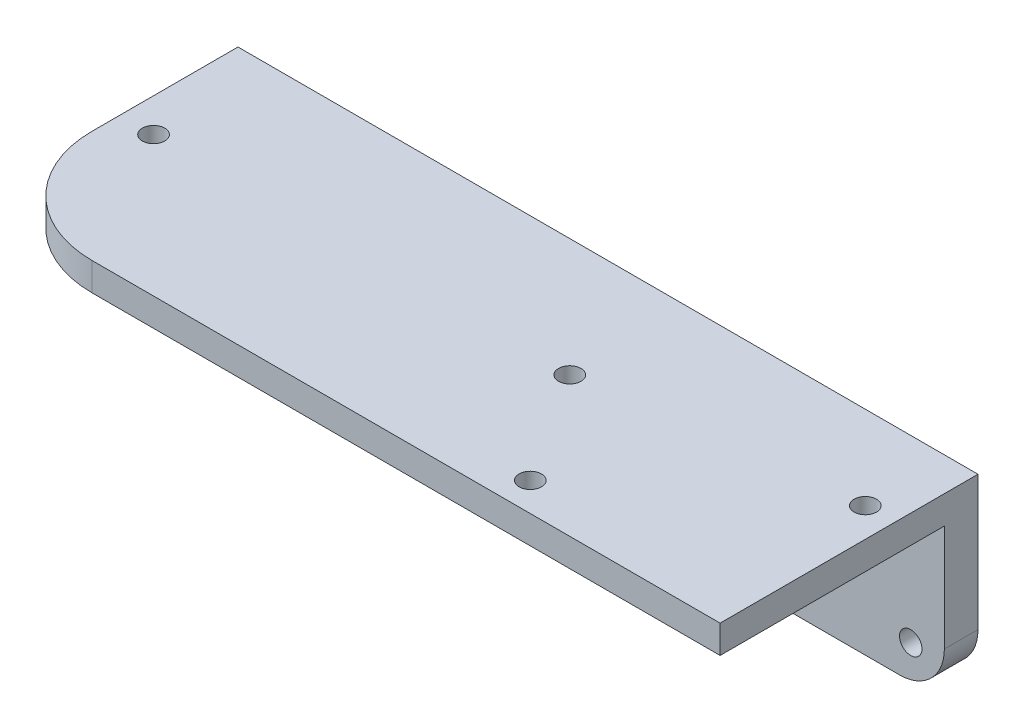
ISO-10303-21;
HEADER;
FILE_DESCRIPTION(('STEP AP214'),'2;1');
FILE_NAME('part.step','',(''),(''),'','','');
FILE_SCHEMA(('AUTOMOTIVE_DESIGN { 1 0 10303 214 1 1 1 1 }'));
ENDSEC;
DATA;
#1=APPLICATION_CONTEXT('core data for automotive mechanical design processes');
#2=APPLICATION_PROTOCOL_DEFINITION('international standard','automotive_design',2000,#1);
#3=PRODUCT_CONTEXT('',#1,'mechanical');
#4=PRODUCT('Part','Part','',(#3));
#5=PRODUCT_RELATED_PRODUCT_CATEGORY('part','',(#4));
#6=PRODUCT_DEFINITION_FORMATION('','',#4);
#7=PRODUCT_DEFINITION_CONTEXT('part definition',#1,'design');
#8=PRODUCT_DEFINITION('design','',#6,#7);
#9=PRODUCT_DEFINITION_SHAPE('','',#8);
#10=(LENGTH_UNIT() NAMED_UNIT(*) SI_UNIT(.MILLI.,.METRE.));
#11=(NAMED_UNIT(*) PLANE_ANGLE_UNIT() SI_UNIT($,.RADIAN.));
#12=(NAMED_UNIT(*) SI_UNIT($,.STERADIAN.) SOLID_ANGLE_UNIT());
#13=UNCERTAINTY_MEASURE_WITH_UNIT(LENGTH_MEASURE(1.E-05),#10,'distance_accuracy_value','');
#14=(GEOMETRIC_REPRESENTATION_CONTEXT(3) GLOBAL_UNCERTAINTY_ASSIGNED_CONTEXT((#13)) GLOBAL_UNIT_ASSIGNED_CONTEXT((#10,
#11,#12)) REPRESENTATION_CONTEXT('',''));
#15=CARTESIAN_POINT('',(0.,0.,0.));
#16=DIRECTION('',(0.,0.,1.));
#17=DIRECTION('',(1.,0.,0.));
#18=AXIS2_PLACEMENT_3D('',#15,#16,#17);
#19=CARTESIAN_POINT('',(0.,0.,3.));
#20=DIRECTION('',(0.,0.,-1.));
#21=DIRECTION('',(-1.,0.,0.));
#22=AXIS2_PLACEMENT_3D('',#19,#20,#21);
#23=PLANE('',#22);
#24=DIRECTION('',(-1.,0.,0.));
#25=VECTOR('',#24,1.);
#26=CARTESIAN_POINT('',(17.5531578100845,-5.,3.));
#27=LINE('',#26,#25);
#28=CARTESIAN_POINT('',(16.5531578100845,-5.,3.));
#29=VERTEX_POINT('',#28);
#30=CARTESIAN_POINT('',(6.55315781008449,-5.,3.));
#31=VERTEX_POINT('',#30);
#32=EDGE_CURVE('E509',#29,#31,#27,.T.);
#33=ORIENTED_EDGE('',*,*,#32,.T.);
#34=CARTESIAN_POINT('',(6.55315781008449,-4.,3.));
#35=DIRECTION('',(0.,0.,-1.));
#36=DIRECTION('',(-1.,0.,0.));
#37=AXIS2_PLACEMENT_3D('',#34,#35,#36);
#38=CIRCLE('',#37,1.);
#39=CARTESIAN_POINT('',(5.55315781008449,-4.,3.));
#40=VERTEX_POINT('',#39);
#41=EDGE_CURVE('E322',#31,#40,#38,.T.);
#42=ORIENTED_EDGE('',*,*,#41,.T.);
#43=DIRECTION('',(0.,1.,0.));
#44=VECTOR('',#43,1.);
#45=CARTESIAN_POINT('',(5.55315781008449,-5.,3.));
#46=LINE('',#45,#44);
#47=CARTESIAN_POINT('',(5.55315781008449,4.,3.));
#48=VERTEX_POINT('',#47);
#49=EDGE_CURVE('E511',#40,#48,#46,.T.);
#50=ORIENTED_EDGE('',*,*,#49,.T.);
#51=CARTESIAN_POINT('',(6.55315781008449,4.,3.));
#52=DIRECTION('',(0.,0.,-1.));
#53=DIRECTION('',(-1.,0.,0.));
#54=AXIS2_PLACEMENT_3D('',#51,#52,#53);
#55=CIRCLE('',#54,1.);
#56=CARTESIAN_POINT('',(6.55315781008449,5.,3.));
#57=VERTEX_POINT('',#56);
#58=EDGE_CURVE('E326',#48,#57,#55,.T.);
#59=ORIENTED_EDGE('',*,*,#58,.T.);
#60=DIRECTION('',(1.,0.,0.));
#61=VECTOR('',#60,1.);
#62=CARTESIAN_POINT('',(17.5531578100845,5.,3.));
#63=LINE('',#62,#61);
#64=CARTESIAN_POINT('',(16.5531578100845,5.,3.));
#65=VERTEX_POINT('',#64);
#66=EDGE_CURVE('E502',#57,#65,#63,.T.);
#67=ORIENTED_EDGE('',*,*,#66,.T.);
#68=CARTESIAN_POINT('',(16.5531578100845,4.,3.));
#69=DIRECTION('',(0.,0.,-1.));
#70=DIRECTION('',(-1.,0.,0.));
#71=AXIS2_PLACEMENT_3D('',#68,#69,#70);
#72=CIRCLE('',#71,1.);
#73=CARTESIAN_POINT('',(17.5531578100845,4.,3.));
#74=VERTEX_POINT('',#73);
#75=EDGE_CURVE('E318',#65,#74,#72,.T.);
#76=ORIENTED_EDGE('',*,*,#75,.T.);
#77=DIRECTION('',(0.,-1.,0.));
#78=VECTOR('',#77,1.);
#79=CARTESIAN_POINT('',(17.5531578100845,-5.,3.));
#80=LINE('',#79,#78);
#81=CARTESIAN_POINT('',(17.5531578100845,-4.,3.));
#82=VERTEX_POINT('',#81);
#83=EDGE_CURVE('E506',#74,#82,#80,.T.);
#84=ORIENTED_EDGE('',*,*,#83,.T.);
#85=CARTESIAN_POINT('',(16.5531578100845,-4.,3.));
#86=DIRECTION('',(0.,0.,-1.));
#87=DIRECTION('',(-1.,0.,0.));
#88=AXIS2_PLACEMENT_3D('',#85,#86,#87);
#89=CIRCLE('',#88,1.);
#90=EDGE_CURVE('E314',#82,#29,#89,.T.);
#91=ORIENTED_EDGE('',*,*,#90,.T.);
#92=EDGE_LOOP('',(#33,#42,#50,#59,#67,#76,#84,#91));
#93=FACE_BOUND('',#92,.T.);
#94=CARTESIAN_POINT('',(-30.,-5.,3.));
#95=DIRECTION('',(0.,0.,1.));
#96=DIRECTION('',(1.,0.,0.));
#97=AXIS2_PLACEMENT_3D('',#94,#95,#96);
#98=CIRCLE('',#97,1.);
#99=CARTESIAN_POINT('',(-29.,-5.,3.));
#100=VERTEX_POINT('',#99);
#101=EDGE_CURVE('E496',#100,#100,#98,.T.);
#102=ORIENTED_EDGE('',*,*,#101,.F.);
#103=EDGE_LOOP('',(#102));
#104=FACE_BOUND('',#103,.T.);
#105=DIRECTION('',(-1.,0.,0.));
#106=VECTOR('',#105,1.);
#107=CARTESIAN_POINT('',(-17.5531578100845,5.,3.));
#108=LINE('',#107,#106);
#109=CARTESIAN_POINT('',(-6.55315781008449,5.,3.));
#110=VERTEX_POINT('',#109);
#111=CARTESIAN_POINT('',(-16.5531578100845,5.,3.));
#112=VERTEX_POINT('',#111);
#113=EDGE_CURVE('E344',#110,#112,#108,.T.);
#114=ORIENTED_EDGE('',*,*,#113,.F.);
#115=CARTESIAN_POINT('',(-6.55315781008449,4.,3.));
#116=DIRECTION('',(0.,0.,-1.));
#117=DIRECTION('',(-1.,0.,0.));
#118=AXIS2_PLACEMENT_3D('',#115,#116,#117);
#119=CIRCLE('',#118,1.);
#120=CARTESIAN_POINT('',(-5.55315781008449,4.,3.));
#121=VERTEX_POINT('',#120);
#122=EDGE_CURVE('E338',#110,#121,#119,.T.);
#123=ORIENTED_EDGE('',*,*,#122,.T.);
#124=DIRECTION('',(0.,1.,0.));
#125=VECTOR('',#124,1.);
#126=CARTESIAN_POINT('',(-5.55315781008449,-5.,3.));
#127=LINE('',#126,#125);
#128=CARTESIAN_POINT('',(-5.55315781008449,-4.,3.));
#129=VERTEX_POINT('',#128);
#130=EDGE_CURVE('E351',#129,#121,#127,.T.);
#131=ORIENTED_EDGE('',*,*,#130,.F.);
#132=CARTESIAN_POINT('',(-6.55315781008449,-4.,3.));
#133=DIRECTION('',(0.,0.,-1.));
#134=DIRECTION('',(-1.,0.,0.));
#135=AXIS2_PLACEMENT_3D('',#132,#133,#134);
#136=CIRCLE('',#135,1.);
#137=CARTESIAN_POINT('',(-6.55315781008449,-5.,3.));
#138=VERTEX_POINT('',#137);
#139=EDGE_CURVE('E330',#129,#138,#136,.T.);
#140=ORIENTED_EDGE('',*,*,#139,.T.);
#141=DIRECTION('',(1.,0.,0.));
#142=VECTOR('',#141,1.);
#143=CARTESIAN_POINT('',(-17.5531578100845,-5.,3.));
#144=LINE('',#143,#142);
#145=CARTESIAN_POINT('',(-16.5531578100845,-5.,3.));
#146=VERTEX_POINT('',#145);
#147=EDGE_CURVE('E377',#146,#138,#144,.T.);
#148=ORIENTED_EDGE('',*,*,#147,.F.);
#149=CARTESIAN_POINT('',(-16.5531578100845,-4.,3.));
#150=DIRECTION('',(0.,0.,-1.));
#151=DIRECTION('',(-1.,0.,0.));
#152=AXIS2_PLACEMENT_3D('',#149,#150,#151);
#153=CIRCLE('',#152,1.);
#154=CARTESIAN_POINT('',(-17.5531578100845,-4.,3.));
#155=VERTEX_POINT('',#154);
#156=EDGE_CURVE('E334',#146,#155,#153,.T.);
#157=ORIENTED_EDGE('',*,*,#156,.T.);
#158=DIRECTION('',(0.,-1.,0.));
#159=VECTOR('',#158,1.);
#160=CARTESIAN_POINT('',(-17.5531578100845,-5.,3.));
#161=LINE('',#160,#159);
#162=CARTESIAN_POINT('',(-17.5531578100845,4.,3.));
#163=VERTEX_POINT('',#162);
#164=EDGE_CURVE('E346',#163,#155,#161,.T.);
#165=ORIENTED_EDGE('',*,*,#164,.F.);
#166=CARTESIAN_POINT('',(-16.5531578100845,4.,3.));
#167=DIRECTION('',(0.,0.,-1.));
#168=DIRECTION('',(-1.,0.,0.));
#169=AXIS2_PLACEMENT_3D('',#166,#167,#168);
#170=CIRCLE('',#169,1.);
#171=EDGE_CURVE('E41',#163,#112,#170,.T.);
#172=ORIENTED_EDGE('',*,*,#171,.T.);
#173=EDGE_LOOP('',(#114,#123,#131,#140,#148,#157,#165,#172));
#174=FACE_BOUND('',#173,.T.);
#175=DIRECTION('',(1.,0.,0.));
#176=VECTOR('',#175,1.);
#177=CARTESIAN_POINT('',(-33.,-8.,3.));
#178=LINE('',#177,#176);
#179=CARTESIAN_POINT('',(-29.,-8.,3.));
#180=VERTEX_POINT('',#179);
#181=CARTESIAN_POINT('',(29.,-8.,3.));
#182=VERTEX_POINT('',#181);
#183=EDGE_CURVE('E593',#180,#182,#178,.T.);
#184=ORIENTED_EDGE('',*,*,#183,.T.);
#185=CARTESIAN_POINT('',(29.,-4.,3.));
#186=DIRECTION('',(0.,0.,-1.));
#187=DIRECTION('',(-1.,0.,0.));
#188=AXIS2_PLACEMENT_3D('',#185,#186,#187);
#189=CIRCLE('',#188,4.);
#190=CARTESIAN_POINT('',(33.,-4.,3.));
#191=VERTEX_POINT('',#190);
#192=EDGE_CURVE('E271',#182,#191,#189,.F.);
#193=ORIENTED_EDGE('',*,*,#192,.T.);
#194=DIRECTION('',(0.,1.,0.));
#195=VECTOR('',#194,1.);
#196=CARTESIAN_POINT('',(33.,-8.,3.));
#197=LINE('',#196,#195);
#198=CARTESIAN_POINT('',(33.,5.5,3.));
#199=VERTEX_POINT('',#198);
#200=EDGE_CURVE('E255',#191,#199,#197,.T.);
#201=ORIENTED_EDGE('',*,*,#200,.T.);
#202=DIRECTION('',(1.,0.,0.));
#203=VECTOR('',#202,1.);
#204=CARTESIAN_POINT('',(-33.,5.5,3.));
#205=LINE('',#204,#203);
#206=CARTESIAN_POINT('',(-33.,5.5,3.));
#207=VERTEX_POINT('',#206);
#208=EDGE_CURVE('E212',#207,#199,#205,.T.);
#209=ORIENTED_EDGE('',*,*,#208,.F.);
#210=DIRECTION('',(0.,-1.,0.));
#211=VECTOR('',#210,1.);
#212=CARTESIAN_POINT('',(-33.,-8.,3.));
#213=LINE('',#212,#211);
#214=CARTESIAN_POINT('',(-33.,-4.,3.));
#215=VERTEX_POINT('',#214);
#216=EDGE_CURVE('E238',#207,#215,#213,.T.);
#217=ORIENTED_EDGE('',*,*,#216,.T.);
#218=CARTESIAN_POINT('',(-29.,-4.,3.));
#219=DIRECTION('',(0.,0.,-1.));
#220=DIRECTION('',(-1.,0.,0.));
#221=AXIS2_PLACEMENT_3D('',#218,#219,#220);
#222=CIRCLE('',#221,4.);
#223=EDGE_CURVE('E269',#215,#180,#222,.F.);
#224=ORIENTED_EDGE('',*,*,#223,.T.);
#225=EDGE_LOOP('',(#184,#193,#201,#209,#217,#224));
#226=FACE_BOUND('',#225,.T.);
#227=CARTESIAN_POINT('',(30.,-5.,3.));
#228=DIRECTION('',(0.,0.,-1.));
#229=DIRECTION('',(-1.,0.,0.));
#230=AXIS2_PLACEMENT_3D('',#227,#228,#229);
#231=CIRCLE('',#230,1.);
#232=CARTESIAN_POINT('',(29.,-5.,3.));
#233=VERTEX_POINT('',#232);
#234=EDGE_CURVE('E525',#233,#233,#231,.T.);
#235=ORIENTED_EDGE('',*,*,#234,.T.);
#236=EDGE_LOOP('',(#235));
#237=FACE_BOUND('',#236,.T.);
#238=ADVANCED_FACE('F33',(#93,#104,#174,#226,#237),#23,.F.);
#239=CARTESIAN_POINT('',(0.,0.,0.));
#240=DIRECTION('',(0.,0.,-1.));
#241=DIRECTION('',(-1.,0.,0.));
#242=AXIS2_PLACEMENT_3D('',#239,#240,#241);
#243=PLANE('',#242);
#244=DIRECTION('',(1.,0.,0.));
#245=VECTOR('',#244,1.);
#246=CARTESIAN_POINT('',(17.5531578100845,5.,0.));
#247=LINE('',#246,#245);
#248=CARTESIAN_POINT('',(6.55315781008449,5.,0.));
#249=VERTEX_POINT('',#248);
#250=CARTESIAN_POINT('',(16.5531578100845,5.,0.));
#251=VERTEX_POINT('',#250);
#252=EDGE_CURVE('E499',#249,#251,#247,.T.);
#253=ORIENTED_EDGE('',*,*,#252,.F.);
#254=CARTESIAN_POINT('',(6.55315781008449,4.,0.));
#255=DIRECTION('',(0.,0.,-1.));
#256=DIRECTION('',(-1.,0.,0.));
#257=AXIS2_PLACEMENT_3D('',#254,#255,#256);
#258=CIRCLE('',#257,1.);
#259=CARTESIAN_POINT('',(5.55315781008449,4.,0.));
#260=VERTEX_POINT('',#259);
#261=EDGE_CURVE('E328',#249,#260,#258,.F.);
#262=ORIENTED_EDGE('',*,*,#261,.T.);
#263=DIRECTION('',(0.,1.,0.));
#264=VECTOR('',#263,1.);
#265=CARTESIAN_POINT('',(5.55315781008449,-5.,0.));
#266=LINE('',#265,#264);
#267=CARTESIAN_POINT('',(5.55315781008449,-4.,0.));
#268=VERTEX_POINT('',#267);
#269=EDGE_CURVE('E505',#268,#260,#266,.T.);
#270=ORIENTED_EDGE('',*,*,#269,.F.);
#271=CARTESIAN_POINT('',(6.55315781008449,-4.,0.));
#272=DIRECTION('',(0.,0.,-1.));
#273=DIRECTION('',(-1.,0.,0.));
#274=AXIS2_PLACEMENT_3D('',#271,#272,#273);
#275=CIRCLE('',#274,1.);
#276=CARTESIAN_POINT('',(6.55315781008449,-5.,0.));
#277=VERTEX_POINT('',#276);
#278=EDGE_CURVE('E324',#268,#277,#275,.F.);
#279=ORIENTED_EDGE('',*,*,#278,.T.);
#280=DIRECTION('',(-1.,0.,0.));
#281=VECTOR('',#280,1.);
#282=CARTESIAN_POINT('',(17.5531578100845,-5.,0.));
#283=LINE('',#282,#281);
#284=CARTESIAN_POINT('',(16.5531578100845,-5.,0.));
#285=VERTEX_POINT('',#284);
#286=EDGE_CURVE('E520',#285,#277,#283,.T.);
#287=ORIENTED_EDGE('',*,*,#286,.F.);
#288=CARTESIAN_POINT('',(16.5531578100845,-4.,0.));
#289=DIRECTION('',(0.,0.,-1.));
#290=DIRECTION('',(-1.,0.,0.));
#291=AXIS2_PLACEMENT_3D('',#288,#289,#290);
#292=CIRCLE('',#291,1.);
#293=CARTESIAN_POINT('',(17.5531578100845,-4.,0.));
#294=VERTEX_POINT('',#293);
#295=EDGE_CURVE('E316',#285,#294,#292,.F.);
#296=ORIENTED_EDGE('',*,*,#295,.T.);
#297=DIRECTION('',(0.,-1.,0.));
#298=VECTOR('',#297,1.);
#299=CARTESIAN_POINT('',(17.5531578100845,-5.,0.));
#300=LINE('',#299,#298);
#301=CARTESIAN_POINT('',(17.5531578100845,4.,0.));
#302=VERTEX_POINT('',#301);
#303=EDGE_CURVE('E517',#302,#294,#300,.T.);
#304=ORIENTED_EDGE('',*,*,#303,.F.);
#305=CARTESIAN_POINT('',(16.5531578100845,4.,0.));
#306=DIRECTION('',(0.,0.,-1.));
#307=DIRECTION('',(-1.,0.,0.));
#308=AXIS2_PLACEMENT_3D('',#305,#306,#307);
#309=CIRCLE('',#308,1.);
#310=EDGE_CURVE('E320',#302,#251,#309,.F.);
#311=ORIENTED_EDGE('',*,*,#310,.T.);
#312=EDGE_LOOP('',(#253,#262,#270,#279,#287,#296,#304,#311));
#313=FACE_BOUND('',#312,.T.);
#314=CARTESIAN_POINT('',(-30.,-5.,0.));
#315=DIRECTION('',(0.,0.,1.));
#316=DIRECTION('',(1.,0.,0.));
#317=AXIS2_PLACEMENT_3D('',#314,#315,#316);
#318=CIRCLE('',#317,1.);
#319=CARTESIAN_POINT('',(-29.,-5.,0.));
#320=VERTEX_POINT('',#319);
#321=EDGE_CURVE('E374',#320,#320,#318,.T.);
#322=ORIENTED_EDGE('',*,*,#321,.T.);
#323=EDGE_LOOP('',(#322));
#324=FACE_BOUND('',#323,.T.);
#325=DIRECTION('',(1.,0.,0.));
#326=VECTOR('',#325,1.);
#327=CARTESIAN_POINT('',(-17.5531578100845,-5.,0.));
#328=LINE('',#327,#326);
#329=CARTESIAN_POINT('',(-16.5531578100845,-5.,0.));
#330=VERTEX_POINT('',#329);
#331=CARTESIAN_POINT('',(-6.55315781008449,-5.,0.));
#332=VERTEX_POINT('',#331);
#333=EDGE_CURVE('E365',#330,#332,#328,.T.);
#334=ORIENTED_EDGE('',*,*,#333,.T.);
#335=CARTESIAN_POINT('',(-6.55315781008449,-4.,0.));
#336=DIRECTION('',(0.,0.,-1.));
#337=DIRECTION('',(-1.,0.,0.));
#338=AXIS2_PLACEMENT_3D('',#335,#336,#337);
#339=CIRCLE('',#338,1.);
#340=CARTESIAN_POINT('',(-5.55315781008449,-4.,0.));
#341=VERTEX_POINT('',#340);
#342=EDGE_CURVE('E332',#332,#341,#339,.F.);
#343=ORIENTED_EDGE('',*,*,#342,.T.);
#344=DIRECTION('',(0.,1.,0.));
#345=VECTOR('',#344,1.);
#346=CARTESIAN_POINT('',(-5.55315781008449,-5.,0.));
#347=LINE('',#346,#345);
#348=CARTESIAN_POINT('',(-5.55315781008449,4.,0.));
#349=VERTEX_POINT('',#348);
#350=EDGE_CURVE('E369',#341,#349,#347,.T.);
#351=ORIENTED_EDGE('',*,*,#350,.T.);
#352=CARTESIAN_POINT('',(-6.55315781008449,4.,0.));
#353=DIRECTION('',(0.,0.,-1.));
#354=DIRECTION('',(-1.,0.,0.));
#355=AXIS2_PLACEMENT_3D('',#352,#353,#354);
#356=CIRCLE('',#355,1.);
#357=CARTESIAN_POINT('',(-6.55315781008449,5.,0.));
#358=VERTEX_POINT('',#357);
#359=EDGE_CURVE('E55',#349,#358,#356,.F.);
#360=ORIENTED_EDGE('',*,*,#359,.T.);
#361=DIRECTION('',(-1.,0.,0.));
#362=VECTOR('',#361,1.);
#363=CARTESIAN_POINT('',(-17.5531578100845,5.,0.));
#364=LINE('',#363,#362);
#365=CARTESIAN_POINT('',(-16.5531578100845,5.,0.));
#366=VERTEX_POINT('',#365);
#367=EDGE_CURVE('E361',#358,#366,#364,.T.);
#368=ORIENTED_EDGE('',*,*,#367,.T.);
#369=CARTESIAN_POINT('',(-16.5531578100845,4.,0.));
#370=DIRECTION('',(0.,0.,-1.));
#371=DIRECTION('',(-1.,0.,0.));
#372=AXIS2_PLACEMENT_3D('',#369,#370,#371);
#373=CIRCLE('',#372,1.);
#374=CARTESIAN_POINT('',(-17.5531578100845,4.,0.));
#375=VERTEX_POINT('',#374);
#376=EDGE_CURVE('E11',#366,#375,#373,.F.);
#377=ORIENTED_EDGE('',*,*,#376,.T.);
#378=DIRECTION('',(0.,-1.,0.));
#379=VECTOR('',#378,1.);
#380=CARTESIAN_POINT('',(-17.5531578100845,-5.,0.));
#381=LINE('',#380,#379);
#382=CARTESIAN_POINT('',(-17.5531578100845,-4.,0.));
#383=VERTEX_POINT('',#382);
#384=EDGE_CURVE('E359',#375,#383,#381,.T.);
#385=ORIENTED_EDGE('',*,*,#384,.T.);
#386=CARTESIAN_POINT('',(-16.5531578100845,-4.,0.));
#387=DIRECTION('',(0.,0.,-1.));
#388=DIRECTION('',(-1.,0.,0.));
#389=AXIS2_PLACEMENT_3D('',#386,#387,#388);
#390=CIRCLE('',#389,1.);
#391=EDGE_CURVE('E336',#383,#330,#390,.F.);
#392=ORIENTED_EDGE('',*,*,#391,.T.);
#393=EDGE_LOOP('',(#334,#343,#351,#360,#368,#377,#385,#392));
#394=FACE_BOUND('',#393,.T.);
#395=DIRECTION('',(0.,1.,0.));
#396=VECTOR('',#395,1.);
#397=CARTESIAN_POINT('',(33.,-8.,0.));
#398=LINE('',#397,#396);
#399=CARTESIAN_POINT('',(33.,-4.,0.));
#400=VERTEX_POINT('',#399);
#401=CARTESIAN_POINT('',(33.,8.,0.));
#402=VERTEX_POINT('',#401);
#403=EDGE_CURVE('E247',#400,#402,#398,.T.);
#404=ORIENTED_EDGE('',*,*,#403,.F.);
#405=CARTESIAN_POINT('',(29.,-4.,0.));
#406=DIRECTION('',(0.,0.,-1.));
#407=DIRECTION('',(-1.,0.,0.));
#408=AXIS2_PLACEMENT_3D('',#405,#406,#407);
#409=CIRCLE('',#408,4.);
#410=CARTESIAN_POINT('',(29.,-8.,0.));
#411=VERTEX_POINT('',#410);
#412=EDGE_CURVE('E262',#400,#411,#409,.T.);
#413=ORIENTED_EDGE('',*,*,#412,.T.);
#414=DIRECTION('',(1.,0.,0.));
#415=VECTOR('',#414,1.);
#416=CARTESIAN_POINT('',(-33.,-8.,0.));
#417=LINE('',#416,#415);
#418=CARTESIAN_POINT('',(-29.,-8.,0.));
#419=VERTEX_POINT('',#418);
#420=EDGE_CURVE('E257',#419,#411,#417,.T.);
#421=ORIENTED_EDGE('',*,*,#420,.F.);
#422=CARTESIAN_POINT('',(-29.,-4.,0.));
#423=DIRECTION('',(0.,0.,-1.));
#424=DIRECTION('',(-1.,0.,0.));
#425=AXIS2_PLACEMENT_3D('',#422,#423,#424);
#426=CIRCLE('',#425,4.);
#427=CARTESIAN_POINT('',(-33.,-4.,0.));
#428=VERTEX_POINT('',#427);
#429=EDGE_CURVE('E260',#419,#428,#426,.T.);
#430=ORIENTED_EDGE('',*,*,#429,.T.);
#431=DIRECTION('',(0.,-1.,0.));
#432=VECTOR('',#431,1.);
#433=CARTESIAN_POINT('',(-33.,-8.,0.));
#434=LINE('',#433,#432);
#435=CARTESIAN_POINT('',(-33.,8.,0.));
#436=VERTEX_POINT('',#435);
#437=EDGE_CURVE('E599',#436,#428,#434,.T.);
#438=ORIENTED_EDGE('',*,*,#437,.F.);
#439=DIRECTION('',(-1.,0.,0.));
#440=VECTOR('',#439,1.);
#441=CARTESIAN_POINT('',(-33.,8.,0.));
#442=LINE('',#441,#440);
#443=EDGE_CURVE('E590',#402,#436,#442,.T.);
#444=ORIENTED_EDGE('',*,*,#443,.F.);
#445=EDGE_LOOP('',(#404,#413,#421,#430,#438,#444));
#446=FACE_BOUND('',#445,.T.);
#447=CARTESIAN_POINT('',(30.,-5.,0.));
#448=DIRECTION('',(0.,0.,-1.));
#449=DIRECTION('',(-1.,0.,0.));
#450=AXIS2_PLACEMENT_3D('',#447,#448,#449);
#451=CIRCLE('',#450,1.);
#452=CARTESIAN_POINT('',(29.,-5.,0.));
#453=VERTEX_POINT('',#452);
#454=EDGE_CURVE('E514',#453,#453,#451,.T.);
#455=ORIENTED_EDGE('',*,*,#454,.F.);
#456=EDGE_LOOP('',(#455));
#457=FACE_BOUND('',#456,.T.);
#458=ADVANCED_FACE('F357',(#313,#324,#394,#446,#457),#243,.T.);
#459=CARTESIAN_POINT('',(33.,-8.,3.));
#460=DIRECTION('',(-1.,0.,0.));
#461=DIRECTION('',(0.,0.,1.));
#462=AXIS2_PLACEMENT_3D('',#459,#460,#461);
#463=PLANE('',#462);
#464=ORIENTED_EDGE('',*,*,#200,.F.);
#465=DIRECTION('',(0.,0.,-1.));
#466=VECTOR('',#465,1.);
#467=CARTESIAN_POINT('',(33.,-4.,3.));
#468=LINE('',#467,#466);
#469=EDGE_CURVE('E254',#191,#400,#468,.T.);
#470=ORIENTED_EDGE('',*,*,#469,.T.);
#471=ORIENTED_EDGE('',*,*,#403,.T.);
#472=DIRECTION('',(0.,0.,-1.));
#473=VECTOR('',#472,1.);
#474=CARTESIAN_POINT('',(33.,8.,3.));
#475=LINE('',#474,#473);
#476=CARTESIAN_POINT('',(33.,8.,23.));
#477=VERTEX_POINT('',#476);
#478=EDGE_CURVE('E226',#477,#402,#475,.T.);
#479=ORIENTED_EDGE('',*,*,#478,.F.);
#480=DIRECTION('',(0.,1.,0.));
#481=VECTOR('',#480,1.);
#482=CARTESIAN_POINT('',(33.,8.,23.));
#483=LINE('',#482,#481);
#484=CARTESIAN_POINT('',(33.,5.5,23.));
#485=VERTEX_POINT('',#484);
#486=EDGE_CURVE('E207',#485,#477,#483,.T.);
#487=ORIENTED_EDGE('',*,*,#486,.F.);
#488=DIRECTION('',(0.,0.,-1.));
#489=VECTOR('',#488,1.);
#490=CARTESIAN_POINT('',(33.,5.5,23.));
#491=LINE('',#490,#489);
#492=EDGE_CURVE('E216',#485,#199,#491,.T.);
#493=ORIENTED_EDGE('',*,*,#492,.T.);
#494=EDGE_LOOP('',(#464,#470,#471,#479,#487,#493));
#495=FACE_BOUND('',#494,.T.);
#496=ADVANCED_FACE('F224',(#495),#463,.F.);
#497=CARTESIAN_POINT('',(-33.,8.,3.));
#498=DIRECTION('',(0.,-1.,0.));
#499=DIRECTION('',(0.,0.,-1.));
#500=AXIS2_PLACEMENT_3D('',#497,#498,#499);
#501=PLANE('',#500);
#502=CARTESIAN_POINT('',(13.51,8.,20.44));
#503=DIRECTION('',(0.,-1.,0.));
#504=DIRECTION('',(0.,0.,-1.));
#505=AXIS2_PLACEMENT_3D('',#502,#503,#504);
#506=CIRCLE('',#505,1.);
#507=CARTESIAN_POINT('',(13.51,8.,19.44));
#508=VERTEX_POINT('',#507);
#509=EDGE_CURVE('E380',#508,#508,#506,.T.);
#510=ORIENTED_EDGE('',*,*,#509,.T.);
#511=EDGE_LOOP('',(#510));
#512=FACE_BOUND('',#511,.T.);
#513=CARTESIAN_POINT('',(30.4,8.,7.45));
#514=DIRECTION('',(0.,-1.,0.));
#515=DIRECTION('',(0.,0.,-1.));
#516=AXIS2_PLACEMENT_3D('',#513,#514,#515);
#517=CIRCLE('',#516,0.999999999999998);
#518=CARTESIAN_POINT('',(30.4,8.,6.45));
#519=VERTEX_POINT('',#518);
#520=EDGE_CURVE('E386',#519,#519,#517,.T.);
#521=ORIENTED_EDGE('',*,*,#520,.T.);
#522=EDGE_LOOP('',(#521));
#523=FACE_BOUND('',#522,.T.);
#524=CARTESIAN_POINT('',(7.12000000000001,8.,10.53));
#525=DIRECTION('',(0.,-1.,0.));
#526=DIRECTION('',(0.,0.,-1.));
#527=AXIS2_PLACEMENT_3D('',#524,#525,#526);
#528=CIRCLE('',#527,1.);
#529=CARTESIAN_POINT('',(7.12000000000001,8.,9.53));
#530=VERTEX_POINT('',#529);
#531=EDGE_CURVE('E392',#530,#530,#528,.T.);
#532=ORIENTED_EDGE('',*,*,#531,.T.);
#533=EDGE_LOOP('',(#532));
#534=FACE_BOUND('',#533,.T.);
#535=CARTESIAN_POINT('',(-30.,8.,10.53));
#536=DIRECTION('',(0.,-1.,0.));
#537=DIRECTION('',(0.,0.,-1.));
#538=AXIS2_PLACEMENT_3D('',#535,#536,#537);
#539=CIRCLE('',#538,0.999999999999998);
#540=CARTESIAN_POINT('',(-30.,8.,9.53));
#541=VERTEX_POINT('',#540);
#542=EDGE_CURVE('E237',#541,#541,#539,.T.);
#543=ORIENTED_EDGE('',*,*,#542,.T.);
#544=EDGE_LOOP('',(#543));
#545=FACE_BOUND('',#544,.T.);
#546=DIRECTION('',(0.,0.,-1.));
#547=VECTOR('',#546,1.);
#548=CARTESIAN_POINT('',(-33.,8.,3.));
#549=LINE('',#548,#547);
#550=CARTESIAN_POINT('',(-33.,8.,13.));
#551=VERTEX_POINT('',#550);
#552=EDGE_CURVE('E587',#551,#436,#549,.T.);
#553=ORIENTED_EDGE('',*,*,#552,.F.);
#554=CARTESIAN_POINT('',(-23.,8.,13.));
#555=DIRECTION('',(0.,-1.,0.));
#556=DIRECTION('',(0.,0.,-1.));
#557=AXIS2_PLACEMENT_3D('',#554,#555,#556);
#558=CIRCLE('',#557,10.);
#559=CARTESIAN_POINT('',(-23.,8.,23.));
#560=VERTEX_POINT('',#559);
#561=EDGE_CURVE('E252',#551,#560,#558,.F.);
#562=ORIENTED_EDGE('',*,*,#561,.T.);
#563=DIRECTION('',(-1.,0.,0.));
#564=VECTOR('',#563,1.);
#565=CARTESIAN_POINT('',(-33.,8.,23.));
#566=LINE('',#565,#564);
#567=EDGE_CURVE('E222',#477,#560,#566,.T.);
#568=ORIENTED_EDGE('',*,*,#567,.F.);
#569=ORIENTED_EDGE('',*,*,#478,.T.);
#570=ORIENTED_EDGE('',*,*,#443,.T.);
#571=EDGE_LOOP('',(#553,#562,#568,#569,#570));
#572=FACE_BOUND('',#571,.T.);
#573=ADVANCED_FACE('F431',(#512,#523,#534,#545,#572),#501,.F.);
#574=CARTESIAN_POINT('',(-33.,-8.,3.));
#575=DIRECTION('',(1.,0.,0.));
#576=DIRECTION('',(0.,0.,-1.));
#577=AXIS2_PLACEMENT_3D('',#574,#575,#576);
#578=PLANE('',#577);
#579=ORIENTED_EDGE('',*,*,#437,.T.);
#580=DIRECTION('',(0.,0.,-1.));
#581=VECTOR('',#580,1.);
#582=CARTESIAN_POINT('',(-33.,-4.,3.));
#583=LINE('',#582,#581);
#584=EDGE_CURVE('E273',#428,#215,#583,.F.);
#585=ORIENTED_EDGE('',*,*,#584,.T.);
#586=ORIENTED_EDGE('',*,*,#216,.F.);
#587=DIRECTION('',(0.,0.,-1.));
#588=VECTOR('',#587,1.);
#589=CARTESIAN_POINT('',(-33.,5.5,23.));
#590=LINE('',#589,#588);
#591=CARTESIAN_POINT('',(-33.,5.5,13.));
#592=VERTEX_POINT('',#591);
#593=EDGE_CURVE('E221',#592,#207,#590,.T.);
#594=ORIENTED_EDGE('',*,*,#593,.F.);
#595=DIRECTION('',(0.,-1.,0.));
#596=VECTOR('',#595,1.);
#597=CARTESIAN_POINT('',(-33.,8.,13.));
#598=LINE('',#597,#596);
#599=EDGE_CURVE('E250',#592,#551,#598,.F.);
#600=ORIENTED_EDGE('',*,*,#599,.T.);
#601=ORIENTED_EDGE('',*,*,#552,.T.);
#602=EDGE_LOOP('',(#579,#585,#586,#594,#600,#601));
#603=FACE_BOUND('',#602,.T.);
#604=ADVANCED_FACE('F413',(#603),#578,.F.);
#605=CARTESIAN_POINT('',(-33.,-8.,3.));
#606=DIRECTION('',(0.,1.,0.));
#607=DIRECTION('',(0.,0.,1.));
#608=AXIS2_PLACEMENT_3D('',#605,#606,#607);
#609=PLANE('',#608);
#610=ORIENTED_EDGE('',*,*,#420,.T.);
#611=DIRECTION('',(0.,0.,-1.));
#612=VECTOR('',#611,1.);
#613=CARTESIAN_POINT('',(29.,-8.,3.));
#614=LINE('',#613,#612);
#615=EDGE_CURVE('E267',#411,#182,#614,.F.);
#616=ORIENTED_EDGE('',*,*,#615,.T.);
#617=ORIENTED_EDGE('',*,*,#183,.F.);
#618=DIRECTION('',(0.,0.,-1.));
#619=VECTOR('',#618,1.);
#620=CARTESIAN_POINT('',(-29.,-8.,3.));
#621=LINE('',#620,#619);
#622=EDGE_CURVE('E264',#180,#419,#621,.T.);
#623=ORIENTED_EDGE('',*,*,#622,.T.);
#624=EDGE_LOOP('',(#610,#616,#617,#623));
#625=FACE_BOUND('',#624,.T.);
#626=ADVANCED_FACE('F405',(#625),#609,.F.);
#627=CARTESIAN_POINT('',(-33.,5.5,23.));
#628=DIRECTION('',(0.,1.,0.));
#629=DIRECTION('',(0.,0.,1.));
#630=AXIS2_PLACEMENT_3D('',#627,#628,#629);
#631=PLANE('',#630);
#632=CARTESIAN_POINT('',(13.51,5.5,20.44));
#633=DIRECTION('',(0.,-1.,0.));
#634=DIRECTION('',(0.,0.,-1.));
#635=AXIS2_PLACEMENT_3D('',#632,#633,#634);
#636=CIRCLE('',#635,1.);
#637=CARTESIAN_POINT('',(13.51,5.5,19.44));
#638=VERTEX_POINT('',#637);
#639=EDGE_CURVE('E367',#638,#638,#636,.T.);
#640=ORIENTED_EDGE('',*,*,#639,.F.);
#641=EDGE_LOOP('',(#640));
#642=FACE_BOUND('',#641,.T.);
#643=CARTESIAN_POINT('',(30.4,5.5,7.45));
#644=DIRECTION('',(0.,-1.,0.));
#645=DIRECTION('',(0.,0.,-1.));
#646=AXIS2_PLACEMENT_3D('',#643,#644,#645);
#647=CIRCLE('',#646,0.999999999999998);
#648=CARTESIAN_POINT('',(30.4,5.5,6.45));
#649=VERTEX_POINT('',#648);
#650=EDGE_CURVE('E383',#649,#649,#647,.T.);
#651=ORIENTED_EDGE('',*,*,#650,.F.);
#652=EDGE_LOOP('',(#651));
#653=FACE_BOUND('',#652,.T.);
#654=CARTESIAN_POINT('',(7.12000000000001,5.5,10.53));
#655=DIRECTION('',(0.,-1.,0.));
#656=DIRECTION('',(0.,0.,-1.));
#657=AXIS2_PLACEMENT_3D('',#654,#655,#656);
#658=CIRCLE('',#657,1.);
#659=CARTESIAN_POINT('',(7.12000000000001,5.5,9.53));
#660=VERTEX_POINT('',#659);
#661=EDGE_CURVE('E389',#660,#660,#658,.T.);
#662=ORIENTED_EDGE('',*,*,#661,.F.);
#663=EDGE_LOOP('',(#662));
#664=FACE_BOUND('',#663,.T.);
#665=CARTESIAN_POINT('',(-30.,5.5,10.53));
#666=DIRECTION('',(0.,-1.,0.));
#667=DIRECTION('',(0.,0.,-1.));
#668=AXIS2_PLACEMENT_3D('',#665,#666,#667);
#669=CIRCLE('',#668,0.999999999999998);
#670=CARTESIAN_POINT('',(-30.,5.5,9.53));
#671=VERTEX_POINT('',#670);
#672=EDGE_CURVE('E395',#671,#671,#669,.T.);
#673=ORIENTED_EDGE('',*,*,#672,.F.);
#674=EDGE_LOOP('',(#673));
#675=FACE_BOUND('',#674,.T.);
#676=DIRECTION('',(1.,0.,0.));
#677=VECTOR('',#676,1.);
#678=CARTESIAN_POINT('',(-33.,5.5,23.));
#679=LINE('',#678,#677);
#680=CARTESIAN_POINT('',(-23.,5.5,23.));
#681=VERTEX_POINT('',#680);
#682=EDGE_CURVE('E202',#681,#485,#679,.T.);
#683=ORIENTED_EDGE('',*,*,#682,.F.);
#684=CARTESIAN_POINT('',(-23.,5.5,13.));
#685=DIRECTION('',(0.,1.,0.));
#686=DIRECTION('',(0.,0.,1.));
#687=AXIS2_PLACEMENT_3D('',#684,#685,#686);
#688=CIRCLE('',#687,10.);
#689=EDGE_CURVE('E248',#681,#592,#688,.F.);
#690=ORIENTED_EDGE('',*,*,#689,.T.);
#691=ORIENTED_EDGE('',*,*,#593,.T.);
#692=ORIENTED_EDGE('',*,*,#208,.T.);
#693=ORIENTED_EDGE('',*,*,#492,.F.);
#694=EDGE_LOOP('',(#683,#690,#691,#692,#693));
#695=FACE_BOUND('',#694,.T.);
#696=ADVANCED_FACE('F217',(#642,#653,#664,#675,#695),#631,.F.);
#697=CARTESIAN_POINT('',(0.,0.,23.));
#698=DIRECTION('',(0.,0.,1.));
#699=DIRECTION('',(1.,0.,0.));
#700=AXIS2_PLACEMENT_3D('',#697,#698,#699);
#701=PLANE('',#700);
#702=ORIENTED_EDGE('',*,*,#567,.T.);
#703=DIRECTION('',(0.,-1.,0.));
#704=VECTOR('',#703,1.);
#705=CARTESIAN_POINT('',(-23.,5.5,23.));
#706=LINE('',#705,#704);
#707=EDGE_CURVE('E210',#560,#681,#706,.T.);
#708=ORIENTED_EDGE('',*,*,#707,.T.);
#709=ORIENTED_EDGE('',*,*,#682,.T.);
#710=ORIENTED_EDGE('',*,*,#486,.T.);
#711=EDGE_LOOP('',(#702,#708,#709,#710));
#712=FACE_BOUND('',#711,.T.);
#713=ADVANCED_FACE('F205',(#712),#701,.T.);
#714=CARTESIAN_POINT('',(-30.,8.,10.53));
#715=DIRECTION('',(0.,-1.,0.));
#716=DIRECTION('',(0.,0.,-1.));
#717=AXIS2_PLACEMENT_3D('',#714,#715,#716);
#718=CYLINDRICAL_SURFACE('',#717,0.999999999999998);
#719=ORIENTED_EDGE('',*,*,#542,.F.);
#720=EDGE_LOOP('',(#719));
#721=FACE_BOUND('',#720,.T.);
#722=ORIENTED_EDGE('',*,*,#672,.T.);
#723=EDGE_LOOP('',(#722));
#724=FACE_BOUND('',#723,.T.);
#725=ADVANCED_FACE('F402',(#721,#724),#718,.F.);
#726=CARTESIAN_POINT('',(7.12000000000001,8.,10.53));
#727=DIRECTION('',(0.,-1.,0.));
#728=DIRECTION('',(0.,0.,-1.));
#729=AXIS2_PLACEMENT_3D('',#726,#727,#728);
#730=CYLINDRICAL_SURFACE('',#729,1.);
#731=ORIENTED_EDGE('',*,*,#531,.F.);
#732=EDGE_LOOP('',(#731));
#733=FACE_BOUND('',#732,.T.);
#734=ORIENTED_EDGE('',*,*,#661,.T.);
#735=EDGE_LOOP('',(#734));
#736=FACE_BOUND('',#735,.T.);
#737=ADVANCED_FACE('F573',(#733,#736),#730,.F.);
#738=CARTESIAN_POINT('',(30.4,8.,7.45));
#739=DIRECTION('',(0.,-1.,0.));
#740=DIRECTION('',(0.,0.,-1.));
#741=AXIS2_PLACEMENT_3D('',#738,#739,#740);
#742=CYLINDRICAL_SURFACE('',#741,0.999999999999998);
#743=ORIENTED_EDGE('',*,*,#520,.F.);
#744=EDGE_LOOP('',(#743));
#745=FACE_BOUND('',#744,.T.);
#746=ORIENTED_EDGE('',*,*,#650,.T.);
#747=EDGE_LOOP('',(#746));
#748=FACE_BOUND('',#747,.T.);
#749=ADVANCED_FACE('F569',(#745,#748),#742,.F.);
#750=CARTESIAN_POINT('',(13.51,8.,20.44));
#751=DIRECTION('',(0.,-1.,0.));
#752=DIRECTION('',(0.,0.,-1.));
#753=AXIS2_PLACEMENT_3D('',#750,#751,#752);
#754=CYLINDRICAL_SURFACE('',#753,1.);
#755=ORIENTED_EDGE('',*,*,#509,.F.);
#756=EDGE_LOOP('',(#755));
#757=FACE_BOUND('',#756,.T.);
#758=ORIENTED_EDGE('',*,*,#639,.T.);
#759=EDGE_LOOP('',(#758));
#760=FACE_BOUND('',#759,.T.);
#761=ADVANCED_FACE('F566',(#757,#760),#754,.F.);
#762=CARTESIAN_POINT('',(-5.55315781008449,-5.,0.));
#763=DIRECTION('',(1.,0.,0.));
#764=DIRECTION('',(0.,0.,-1.));
#765=AXIS2_PLACEMENT_3D('',#762,#763,#764);
#766=PLANE('',#765);
#767=ORIENTED_EDGE('',*,*,#350,.F.);
#768=DIRECTION('',(0.,0.,1.));
#769=VECTOR('',#768,1.);
#770=CARTESIAN_POINT('',(-5.55315781008449,-4.,3.));
#771=LINE('',#770,#769);
#772=EDGE_CURVE('E297',#341,#129,#771,.T.);
#773=ORIENTED_EDGE('',*,*,#772,.T.);
#774=ORIENTED_EDGE('',*,*,#130,.T.);
#775=DIRECTION('',(0.,0.,1.));
#776=VECTOR('',#775,1.);
#777=CARTESIAN_POINT('',(-5.55315781008449,4.,0.));
#778=LINE('',#777,#776);
#779=EDGE_CURVE('E295',#121,#349,#778,.F.);
#780=ORIENTED_EDGE('',*,*,#779,.T.);
#781=EDGE_LOOP('',(#767,#773,#774,#780));
#782=FACE_BOUND('',#781,.T.);
#783=ADVANCED_FACE('F486',(#782),#766,.F.);
#784=CARTESIAN_POINT('',(-17.5531578100845,-5.,0.));
#785=DIRECTION('',(0.,-1.,0.));
#786=DIRECTION('',(1.,0.,0.));
#787=AXIS2_PLACEMENT_3D('',#784,#785,#786);
#788=PLANE('',#787);
#789=ORIENTED_EDGE('',*,*,#147,.T.);
#790=DIRECTION('',(0.,0.,1.));
#791=VECTOR('',#790,1.);
#792=CARTESIAN_POINT('',(-6.55315781008449,-5.,0.));
#793=LINE('',#792,#791);
#794=EDGE_CURVE('E303',#138,#332,#793,.F.);
#795=ORIENTED_EDGE('',*,*,#794,.T.);
#796=ORIENTED_EDGE('',*,*,#333,.F.);
#797=DIRECTION('',(0.,0.,1.));
#798=VECTOR('',#797,1.);
#799=CARTESIAN_POINT('',(-16.5531578100845,-5.,3.));
#800=LINE('',#799,#798);
#801=EDGE_CURVE('E300',#330,#146,#800,.T.);
#802=ORIENTED_EDGE('',*,*,#801,.T.);
#803=EDGE_LOOP('',(#789,#795,#796,#802));
#804=FACE_BOUND('',#803,.T.);
#805=ADVANCED_FACE('F492',(#804),#788,.F.);
#806=CARTESIAN_POINT('',(-17.5531578100845,-5.,0.));
#807=DIRECTION('',(-1.,0.,0.));
#808=DIRECTION('',(0.,0.,1.));
#809=AXIS2_PLACEMENT_3D('',#806,#807,#808);
#810=PLANE('',#809);
#811=ORIENTED_EDGE('',*,*,#164,.T.);
#812=DIRECTION('',(0.,0.,1.));
#813=VECTOR('',#812,1.);
#814=CARTESIAN_POINT('',(-17.5531578100845,-4.,0.));
#815=LINE('',#814,#813);
#816=EDGE_CURVE('E308',#155,#383,#815,.F.);
#817=ORIENTED_EDGE('',*,*,#816,.T.);
#818=ORIENTED_EDGE('',*,*,#384,.F.);
#819=DIRECTION('',(0.,0.,1.));
#820=VECTOR('',#819,1.);
#821=CARTESIAN_POINT('',(-17.5531578100845,4.,3.));
#822=LINE('',#821,#820);
#823=EDGE_CURVE('E305',#375,#163,#822,.T.);
#824=ORIENTED_EDGE('',*,*,#823,.T.);
#825=EDGE_LOOP('',(#811,#817,#818,#824));
#826=FACE_BOUND('',#825,.T.);
#827=ADVANCED_FACE('F363',(#826),#810,.F.);
#828=CARTESIAN_POINT('',(-17.5531578100845,5.,0.));
#829=DIRECTION('',(0.,1.,0.));
#830=DIRECTION('',(-1.,0.,0.));
#831=AXIS2_PLACEMENT_3D('',#828,#829,#830);
#832=PLANE('',#831);
#833=ORIENTED_EDGE('',*,*,#367,.F.);
#834=DIRECTION('',(0.,0.,1.));
#835=VECTOR('',#834,1.);
#836=CARTESIAN_POINT('',(-6.55315781008449,5.,3.));
#837=LINE('',#836,#835);
#838=EDGE_CURVE('E311',#358,#110,#837,.T.);
#839=ORIENTED_EDGE('',*,*,#838,.T.);
#840=ORIENTED_EDGE('',*,*,#113,.T.);
#841=DIRECTION('',(0.,0.,1.));
#842=VECTOR('',#841,1.);
#843=CARTESIAN_POINT('',(-16.5531578100845,5.,0.));
#844=LINE('',#843,#842);
#845=EDGE_CURVE('E48',#112,#366,#844,.F.);
#846=ORIENTED_EDGE('',*,*,#845,.T.);
#847=EDGE_LOOP('',(#833,#839,#840,#846));
#848=FACE_BOUND('',#847,.T.);
#849=ADVANCED_FACE('F349',(#848),#832,.F.);
#850=CARTESIAN_POINT('',(-30.,-5.,0.));
#851=DIRECTION('',(0.,0.,1.));
#852=DIRECTION('',(1.,0.,0.));
#853=AXIS2_PLACEMENT_3D('',#850,#851,#852);
#854=CYLINDRICAL_SURFACE('',#853,1.);
#855=ORIENTED_EDGE('',*,*,#321,.F.);
#856=EDGE_LOOP('',(#855));
#857=FACE_BOUND('',#856,.T.);
#858=ORIENTED_EDGE('',*,*,#101,.T.);
#859=EDGE_LOOP('',(#858));
#860=FACE_BOUND('',#859,.T.);
#861=ADVANCED_FACE('F442',(#857,#860),#854,.F.);
#862=CARTESIAN_POINT('',(-23.,0.,13.));
#863=DIRECTION('',(0.,1.,0.));
#864=DIRECTION('',(0.,0.,1.));
#865=AXIS2_PLACEMENT_3D('',#862,#863,#864);
#866=CYLINDRICAL_SURFACE('',#865,10.);
#867=ORIENTED_EDGE('',*,*,#561,.F.);
#868=ORIENTED_EDGE('',*,*,#599,.F.);
#869=ORIENTED_EDGE('',*,*,#689,.F.);
#870=ORIENTED_EDGE('',*,*,#707,.F.);
#871=EDGE_LOOP('',(#867,#868,#869,#870));
#872=FACE_BOUND('',#871,.T.);
#873=ADVANCED_FACE('F438',(#872),#866,.T.);
#874=CARTESIAN_POINT('',(29.,-4.,3.));
#875=DIRECTION('',(0.,0.,-1.));
#876=DIRECTION('',(-1.,0.,0.));
#877=AXIS2_PLACEMENT_3D('',#874,#875,#876);
#878=CYLINDRICAL_SURFACE('',#877,4.);
#879=ORIENTED_EDGE('',*,*,#192,.F.);
#880=ORIENTED_EDGE('',*,*,#615,.F.);
#881=ORIENTED_EDGE('',*,*,#412,.F.);
#882=ORIENTED_EDGE('',*,*,#469,.F.);
#883=EDGE_LOOP('',(#879,#880,#881,#882));
#884=FACE_BOUND('',#883,.T.);
#885=ADVANCED_FACE('F441',(#884),#878,.T.);
#886=CARTESIAN_POINT('',(-29.,-4.,3.));
#887=DIRECTION('',(0.,0.,-1.));
#888=DIRECTION('',(-1.,0.,0.));
#889=AXIS2_PLACEMENT_3D('',#886,#887,#888);
#890=CYLINDRICAL_SURFACE('',#889,4.);
#891=ORIENTED_EDGE('',*,*,#223,.F.);
#892=ORIENTED_EDGE('',*,*,#584,.F.);
#893=ORIENTED_EDGE('',*,*,#429,.F.);
#894=ORIENTED_EDGE('',*,*,#622,.F.);
#895=EDGE_LOOP('',(#891,#892,#893,#894));
#896=FACE_BOUND('',#895,.T.);
#897=ADVANCED_FACE('F446',(#896),#890,.T.);
#898=CARTESIAN_POINT('',(5.55315781008449,-5.,0.));
#899=DIRECTION('',(1.,0.,0.));
#900=DIRECTION('',(0.,0.,-1.));
#901=AXIS2_PLACEMENT_3D('',#898,#899,#900);
#902=PLANE('',#901);
#903=ORIENTED_EDGE('',*,*,#49,.F.);
#904=DIRECTION('',(0.,0.,1.));
#905=VECTOR('',#904,1.);
#906=CARTESIAN_POINT('',(5.55315781008449,-4.,0.));
#907=LINE('',#906,#905);
#908=EDGE_CURVE('E293',#40,#268,#907,.F.);
#909=ORIENTED_EDGE('',*,*,#908,.T.);
#910=ORIENTED_EDGE('',*,*,#269,.T.);
#911=DIRECTION('',(0.,0.,1.));
#912=VECTOR('',#911,1.);
#913=CARTESIAN_POINT('',(5.55315781008449,4.,3.));
#914=LINE('',#913,#912);
#915=EDGE_CURVE('E290',#260,#48,#914,.T.);
#916=ORIENTED_EDGE('',*,*,#915,.T.);
#917=EDGE_LOOP('',(#903,#909,#910,#916));
#918=FACE_BOUND('',#917,.T.);
#919=ADVANCED_FACE('F450',(#918),#902,.T.);
#920=CARTESIAN_POINT('',(17.5531578100845,5.,0.));
#921=DIRECTION('',(0.,-1.,0.));
#922=DIRECTION('',(1.,0.,0.));
#923=AXIS2_PLACEMENT_3D('',#920,#921,#922);
#924=PLANE('',#923);
#925=ORIENTED_EDGE('',*,*,#252,.T.);
#926=DIRECTION('',(0.,0.,1.));
#927=VECTOR('',#926,1.);
#928=CARTESIAN_POINT('',(16.5531578100845,5.,3.));
#929=LINE('',#928,#927);
#930=EDGE_CURVE('E287',#251,#65,#929,.T.);
#931=ORIENTED_EDGE('',*,*,#930,.T.);
#932=ORIENTED_EDGE('',*,*,#66,.F.);
#933=DIRECTION('',(0.,0.,1.));
#934=VECTOR('',#933,1.);
#935=CARTESIAN_POINT('',(6.55315781008449,5.,0.));
#936=LINE('',#935,#934);
#937=EDGE_CURVE('E285',#57,#249,#936,.F.);
#938=ORIENTED_EDGE('',*,*,#937,.T.);
#939=EDGE_LOOP('',(#925,#931,#932,#938));
#940=FACE_BOUND('',#939,.T.);
#941=ADVANCED_FACE('F545',(#940),#924,.T.);
#942=CARTESIAN_POINT('',(17.5531578100845,-5.,0.));
#943=DIRECTION('',(-1.,0.,0.));
#944=DIRECTION('',(0.,0.,1.));
#945=AXIS2_PLACEMENT_3D('',#942,#943,#944);
#946=PLANE('',#945);
#947=ORIENTED_EDGE('',*,*,#303,.T.);
#948=DIRECTION('',(0.,0.,1.));
#949=VECTOR('',#948,1.);
#950=CARTESIAN_POINT('',(17.5531578100845,-4.,3.));
#951=LINE('',#950,#949);
#952=EDGE_CURVE('E277',#294,#82,#951,.T.);
#953=ORIENTED_EDGE('',*,*,#952,.T.);
#954=ORIENTED_EDGE('',*,*,#83,.F.);
#955=DIRECTION('',(0.,0.,1.));
#956=VECTOR('',#955,1.);
#957=CARTESIAN_POINT('',(17.5531578100845,4.,0.));
#958=LINE('',#957,#956);
#959=EDGE_CURVE('E275',#74,#302,#958,.F.);
#960=ORIENTED_EDGE('',*,*,#959,.T.);
#961=EDGE_LOOP('',(#947,#953,#954,#960));
#962=FACE_BOUND('',#961,.T.);
#963=ADVANCED_FACE('F541',(#962),#946,.T.);
#964=CARTESIAN_POINT('',(17.5531578100845,-5.,0.));
#965=DIRECTION('',(0.,1.,0.));
#966=DIRECTION('',(-1.,0.,0.));
#967=AXIS2_PLACEMENT_3D('',#964,#965,#966);
#968=PLANE('',#967);
#969=ORIENTED_EDGE('',*,*,#32,.F.);
#970=DIRECTION('',(0.,0.,1.));
#971=VECTOR('',#970,1.);
#972=CARTESIAN_POINT('',(16.5531578100845,-5.,0.));
#973=LINE('',#972,#971);
#974=EDGE_CURVE('E283',#29,#285,#973,.F.);
#975=ORIENTED_EDGE('',*,*,#974,.T.);
#976=ORIENTED_EDGE('',*,*,#286,.T.);
#977=DIRECTION('',(0.,0.,1.));
#978=VECTOR('',#977,1.);
#979=CARTESIAN_POINT('',(6.55315781008449,-5.,3.));
#980=LINE('',#979,#978);
#981=EDGE_CURVE('E280',#277,#31,#980,.T.);
#982=ORIENTED_EDGE('',*,*,#981,.T.);
#983=EDGE_LOOP('',(#969,#975,#976,#982));
#984=FACE_BOUND('',#983,.T.);
#985=ADVANCED_FACE('F534',(#984),#968,.T.);
#986=CARTESIAN_POINT('',(30.,-5.,0.));
#987=DIRECTION('',(0.,0.,1.));
#988=DIRECTION('',(1.,0.,0.));
#989=AXIS2_PLACEMENT_3D('',#986,#987,#988);
#990=CYLINDRICAL_SURFACE('',#989,1.);
#991=ORIENTED_EDGE('',*,*,#454,.T.);
#992=EDGE_LOOP('',(#991));
#993=FACE_BOUND('',#992,.T.);
#994=ORIENTED_EDGE('',*,*,#234,.F.);
#995=EDGE_LOOP('',(#994));
#996=FACE_BOUND('',#995,.T.);
#997=ADVANCED_FACE('F456',(#993,#996),#990,.F.);
#998=CARTESIAN_POINT('',(16.5531578100845,-4.,0.));
#999=DIRECTION('',(0.,0.,-1.));
#1000=DIRECTION('',(-1.,0.,0.));
#1001=AXIS2_PLACEMENT_3D('',#998,#999,#1000);
#1002=CYLINDRICAL_SURFACE('',#1001,1.);
#1003=ORIENTED_EDGE('',*,*,#295,.F.);
#1004=ORIENTED_EDGE('',*,*,#974,.F.);
#1005=ORIENTED_EDGE('',*,*,#90,.F.);
#1006=ORIENTED_EDGE('',*,*,#952,.F.);
#1007=EDGE_LOOP('',(#1003,#1004,#1005,#1006));
#1008=FACE_BOUND('',#1007,.T.);
#1009=ADVANCED_FACE('F452',(#1008),#1002,.F.);
#1010=CARTESIAN_POINT('',(16.5531578100845,4.,0.));
#1011=DIRECTION('',(0.,0.,-1.));
#1012=DIRECTION('',(-1.,0.,0.));
#1013=AXIS2_PLACEMENT_3D('',#1010,#1011,#1012);
#1014=CYLINDRICAL_SURFACE('',#1013,1.);
#1015=ORIENTED_EDGE('',*,*,#310,.F.);
#1016=ORIENTED_EDGE('',*,*,#959,.F.);
#1017=ORIENTED_EDGE('',*,*,#75,.F.);
#1018=ORIENTED_EDGE('',*,*,#930,.F.);
#1019=EDGE_LOOP('',(#1015,#1016,#1017,#1018));
#1020=FACE_BOUND('',#1019,.T.);
#1021=ADVANCED_FACE('F455',(#1020),#1014,.F.);
#1022=CARTESIAN_POINT('',(6.55315781008449,-4.,0.));
#1023=DIRECTION('',(0.,0.,-1.));
#1024=DIRECTION('',(-1.,0.,0.));
#1025=AXIS2_PLACEMENT_3D('',#1022,#1023,#1024);
#1026=CYLINDRICAL_SURFACE('',#1025,1.);
#1027=ORIENTED_EDGE('',*,*,#278,.F.);
#1028=ORIENTED_EDGE('',*,*,#908,.F.);
#1029=ORIENTED_EDGE('',*,*,#41,.F.);
#1030=ORIENTED_EDGE('',*,*,#981,.F.);
#1031=EDGE_LOOP('',(#1027,#1028,#1029,#1030));
#1032=FACE_BOUND('',#1031,.T.);
#1033=ADVANCED_FACE('F460',(#1032),#1026,.F.);
#1034=CARTESIAN_POINT('',(6.55315781008449,4.,0.));
#1035=DIRECTION('',(0.,0.,-1.));
#1036=DIRECTION('',(-1.,0.,0.));
#1037=AXIS2_PLACEMENT_3D('',#1034,#1035,#1036);
#1038=CYLINDRICAL_SURFACE('',#1037,1.);
#1039=ORIENTED_EDGE('',*,*,#261,.F.);
#1040=ORIENTED_EDGE('',*,*,#937,.F.);
#1041=ORIENTED_EDGE('',*,*,#58,.F.);
#1042=ORIENTED_EDGE('',*,*,#915,.F.);
#1043=EDGE_LOOP('',(#1039,#1040,#1041,#1042));
#1044=FACE_BOUND('',#1043,.T.);
#1045=ADVANCED_FACE('F464',(#1044),#1038,.F.);
#1046=CARTESIAN_POINT('',(-6.55315781008449,-4.,0.));
#1047=DIRECTION('',(0.,0.,-1.));
#1048=DIRECTION('',(-1.,0.,0.));
#1049=AXIS2_PLACEMENT_3D('',#1046,#1047,#1048);
#1050=CYLINDRICAL_SURFACE('',#1049,1.);
#1051=ORIENTED_EDGE('',*,*,#342,.F.);
#1052=ORIENTED_EDGE('',*,*,#794,.F.);
#1053=ORIENTED_EDGE('',*,*,#139,.F.);
#1054=ORIENTED_EDGE('',*,*,#772,.F.);
#1055=EDGE_LOOP('',(#1051,#1052,#1053,#1054));
#1056=FACE_BOUND('',#1055,.T.);
#1057=ADVANCED_FACE('F468',(#1056),#1050,.F.);
#1058=CARTESIAN_POINT('',(-16.5531578100845,-4.,0.));
#1059=DIRECTION('',(0.,0.,-1.));
#1060=DIRECTION('',(-1.,0.,0.));
#1061=AXIS2_PLACEMENT_3D('',#1058,#1059,#1060);
#1062=CYLINDRICAL_SURFACE('',#1061,1.);
#1063=ORIENTED_EDGE('',*,*,#391,.F.);
#1064=ORIENTED_EDGE('',*,*,#816,.F.);
#1065=ORIENTED_EDGE('',*,*,#156,.F.);
#1066=ORIENTED_EDGE('',*,*,#801,.F.);
#1067=EDGE_LOOP('',(#1063,#1064,#1065,#1066));
#1068=FACE_BOUND('',#1067,.T.);
#1069=ADVANCED_FACE('F472',(#1068),#1062,.F.);
#1070=CARTESIAN_POINT('',(-6.55315781008449,4.,0.));
#1071=DIRECTION('',(0.,0.,-1.));
#1072=DIRECTION('',(-1.,0.,0.));
#1073=AXIS2_PLACEMENT_3D('',#1070,#1071,#1072);
#1074=CYLINDRICAL_SURFACE('',#1073,1.);
#1075=ORIENTED_EDGE('',*,*,#359,.F.);
#1076=ORIENTED_EDGE('',*,*,#779,.F.);
#1077=ORIENTED_EDGE('',*,*,#122,.F.);
#1078=ORIENTED_EDGE('',*,*,#838,.F.);
#1079=EDGE_LOOP('',(#1075,#1076,#1077,#1078));
#1080=FACE_BOUND('',#1079,.T.);
#1081=ADVANCED_FACE('F475',(#1080),#1074,.F.);
#1082=CARTESIAN_POINT('',(-16.5531578100845,4.,0.));
#1083=DIRECTION('',(0.,0.,-1.));
#1084=DIRECTION('',(-1.,0.,0.));
#1085=AXIS2_PLACEMENT_3D('',#1082,#1083,#1084);
#1086=CYLINDRICAL_SURFACE('',#1085,1.);
#1087=ORIENTED_EDGE('',*,*,#376,.F.);
#1088=ORIENTED_EDGE('',*,*,#845,.F.);
#1089=ORIENTED_EDGE('',*,*,#171,.F.);
#1090=ORIENTED_EDGE('',*,*,#823,.F.);
#1091=EDGE_LOOP('',(#1087,#1088,#1089,#1090));
#1092=FACE_BOUND('',#1091,.T.);
#1093=ADVANCED_FACE('F35',(#1092),#1086,.F.);
#1094=CLOSED_SHELL('',(#238,#458,#496,#573,#604,#626,#696,#713,#725,#737,#749,#761,#783,#805,
#827,#849,#861,#873,#885,#897,#919,#941,#963,#985,#997,#1009,#1021,#1033,#1045,#1057,#1069,
#1081,#1093));
#1095=MANIFOLD_SOLID_BREP('B2',#1094);
#1096=ADVANCED_BREP_SHAPE_REPRESENTATION('',(#18,#1095),#14);
#1097=SHAPE_DEFINITION_REPRESENTATION(#9,#1096);
ENDSEC;
END-ISO-10303-21;
